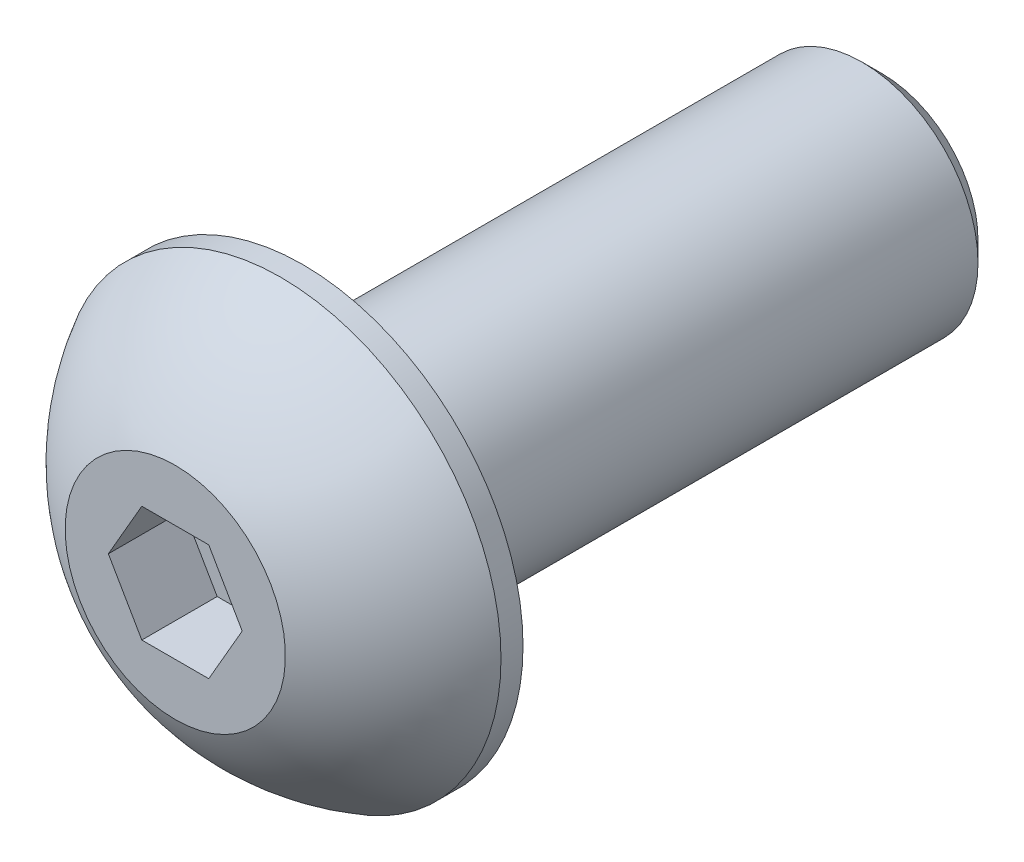
ISO-10303-21;
HEADER;
FILE_DESCRIPTION(('STEP AP214'),'2;1');
FILE_NAME('part.step','',(''),(''),'','','');
FILE_SCHEMA(('AUTOMOTIVE_DESIGN { 1 0 10303 214 1 1 1 1 }'));
ENDSEC;
DATA;
#1=APPLICATION_CONTEXT('core data for automotive mechanical design processes');
#2=APPLICATION_PROTOCOL_DEFINITION('international standard','automotive_design',2000,#1);
#3=PRODUCT_CONTEXT('',#1,'mechanical');
#4=PRODUCT('Part','Part','',(#3));
#5=PRODUCT_RELATED_PRODUCT_CATEGORY('part','',(#4));
#6=PRODUCT_DEFINITION_FORMATION('','',#4);
#7=PRODUCT_DEFINITION_CONTEXT('part definition',#1,'design');
#8=PRODUCT_DEFINITION('design','',#6,#7);
#9=PRODUCT_DEFINITION_SHAPE('','',#8);
#10=(LENGTH_UNIT() NAMED_UNIT(*) SI_UNIT(.MILLI.,.METRE.));
#11=(NAMED_UNIT(*) PLANE_ANGLE_UNIT() SI_UNIT($,.RADIAN.));
#12=(NAMED_UNIT(*) SI_UNIT($,.STERADIAN.) SOLID_ANGLE_UNIT());
#13=UNCERTAINTY_MEASURE_WITH_UNIT(LENGTH_MEASURE(1.E-05),#10,'distance_accuracy_value','');
#14=(GEOMETRIC_REPRESENTATION_CONTEXT(3) GLOBAL_UNCERTAINTY_ASSIGNED_CONTEXT((#13)) GLOBAL_UNIT_ASSIGNED_CONTEXT((#10,
#11,#12)) REPRESENTATION_CONTEXT('',''));
#15=CARTESIAN_POINT('',(0.,0.,0.));
#16=DIRECTION('',(0.,0.,1.));
#17=DIRECTION('',(1.,0.,0.));
#18=AXIS2_PLACEMENT_3D('',#15,#16,#17);
#19=CARTESIAN_POINT('',(0.,0.,-1.68527472527472));
#20=DIRECTION('',(0.,0.,-1.));
#21=DIRECTION('',(0.,-1.,0.));
#22=AXIS2_PLACEMENT_3D('',#19,#20,#21);
#23=SPHERICAL_SURFACE('',#22,4.3249693283142);
#24=CARTESIAN_POINT('',(0.,0.,2.2));
#25=DIRECTION('',(0.,0.,-1.));
#26=DIRECTION('',(0.,1.,0.));
#27=AXIS2_PLACEMENT_3D('',#24,#25,#26);
#28=CIRCLE('',#27,1.9);
#29=CARTESIAN_POINT('',(0.,-1.9,2.2));
#30=VERTEX_POINT('',#29);
#31=EDGE_CURVE('E184',#30,#30,#28,.T.);
#32=CARTESIAN_POINT('',(0.,0.,0.379999999999998));
#33=DIRECTION('',(0.,0.,-1.));
#34=DIRECTION('',(0.,1.,0.));
#35=AXIS2_PLACEMENT_3D('',#32,#33,#34);
#36=CIRCLE('',#35,3.8);
#37=CARTESIAN_POINT('',(0.,-3.8,0.379999999999998));
#38=VERTEX_POINT('',#37);
#39=EDGE_CURVE('E167',#38,#38,#36,.T.);
#40=CARTESIAN_POINT('',(0.,-1.9,2.2));
#41=CARTESIAN_POINT('',(0.,-1.9250168345864,2.18776615986538));
#42=CARTESIAN_POINT('',(0.,-1.94991547834234,2.1752906362405));
#43=CARTESIAN_POINT('',(0.,-1.99946716625955,2.14986101771974));
#44=CARTESIAN_POINT('',(0.,-2.02412021042083,2.13690692282386));
#45=CARTESIAN_POINT('',(0.,-2.07317148121498,2.11052495747061));
#46=CARTESIAN_POINT('',(0.,-2.09756970784785,2.09709708701323));
#47=CARTESIAN_POINT('',(0.,-2.14610224528364,2.06977259086845));
#48=CARTESIAN_POINT('',(0.,-2.17023655608655,2.05587596518104));
#49=CARTESIAN_POINT('',(0.,-2.21823225545407,2.02761914098968));
#50=CARTESIAN_POINT('',(0.,-2.24209364401868,2.01325894248572));
#51=CARTESIAN_POINT('',(0.,-2.28953459609717,1.98408033147872));
#52=CARTESIAN_POINT('',(0.,-2.31311415961106,1.96926191897566));
#53=CARTESIAN_POINT('',(0.,-2.35998266345818,1.93917240883671));
#54=CARTESIAN_POINT('',(0.,-2.38327160379141,1.92390131120081));
#55=CARTESIAN_POINT('',(0.,-2.42955017171145,1.89291212881537));
#56=CARTESIAN_POINT('',(0.,-2.45253979929826,1.87719404406583));
#57=CARTESIAN_POINT('',(0.,-2.49821116380567,1.84531675218651));
#58=CARTESIAN_POINT('',(0.,-2.52089290072626,1.82915754505673));
#59=CARTESIAN_POINT('',(0.,-2.56594002087097,1.79640403776007));
#60=CARTESIAN_POINT('',(0.,-2.58830540409509,1.77980973759318));
#61=CARTESIAN_POINT('',(0.,-2.63271147185239,1.74619223590302));
#62=CARTESIAN_POINT('',(0.,-2.65475215638556,1.72916903437974));
#63=CARTESIAN_POINT('',(0.,-2.69850060291903,1.69470008169092));
#64=CARTESIAN_POINT('',(0.,-2.72020836491933,1.67725433052536));
#65=CARTESIAN_POINT('',(0.,-2.76328286676534,1.64194678792786));
#66=CARTESIAN_POINT('',(0.,-2.78464960661105,1.62408499649592));
#67=CARTESIAN_POINT('',(0.,-2.82703409176873,1.587952037975));
#68=CARTESIAN_POINT('',(0.,-2.84805183708071,1.56968087088603));
#69=CARTESIAN_POINT('',(0.,-2.88973049100894,1.53273597840701));
#70=CARTESIAN_POINT('',(0.,-2.91039139962521,1.51406225301696));
#71=CARTESIAN_POINT('',(0.,-2.95134867114332,1.47631921149475));
#72=CARTESIAN_POINT('',(0.,-2.97164503404517,1.45724989536258));
#73=CARTESIAN_POINT('',(0.,-3.01186564113541,1.41872278751825));
#74=CARTESIAN_POINT('',(0.,-3.0317898853238,1.39926499580609));
#75=CARTESIAN_POINT('',(0.,-3.07125882083336,1.35996819691231));
#76=CARTESIAN_POINT('',(0.,-3.09080351215454,1.34012918973069));
#77=CARTESIAN_POINT('',(0.,-3.12950604939509,1.30007736224804));
#78=CARTESIAN_POINT('',(0.,-3.14866389531445,1.279864541947));
#79=CARTESIAN_POINT('',(0.,-3.18658559355691,1.23907263005305));
#80=CARTESIAN_POINT('',(0.,-3.20534944588,1.21849353846013));
#81=CARTESIAN_POINT('',(0.,-3.24247615574272,1.17697676247348));
#82=CARTESIAN_POINT('',(0.,-3.26083901328234,1.15603907807975));
#83=CARTESIAN_POINT('',(0.,-3.29715688201057,1.11381292878105));
#84=CARTESIAN_POINT('',(0.,-3.31511189319918,1.09252446387609));
#85=CARTESIAN_POINT('',(0.,-3.35060736983354,1.04960469672792));
#86=CARTESIAN_POINT('',(0.,-3.3681478352793,1.02797339448472));
#87=CARTESIAN_POINT('',(0.,-3.40280767571308,0.984376023753563));
#88=CARTESIAN_POINT('',(0.,-3.41992705070111,0.962409955265613));
#89=CARTESIAN_POINT('',(0.,-3.45373832261761,0.918151248044141));
#90=CARTESIAN_POINT('',(0.,-3.47043021954608,0.895858609310618));
#91=CARTESIAN_POINT('',(0.,-3.50338030725998,0.850955079457227));
#92=CARTESIAN_POINT('',(0.,-3.51963849804541,0.828344188337359));
#93=CARTESIAN_POINT('',(0.,-3.55171510715004,0.782812590280425));
#94=CARTESIAN_POINT('',(0.,-3.56753352546924,0.75989188334336));
#95=CARTESIAN_POINT('',(0.,-3.59872468764754,0.713749205957023));
#96=CARTESIAN_POINT('',(0.,-3.61409743150663,0.690527235507752));
#97=CARTESIAN_POINT('',(0.,-3.64439150816201,0.643790695298227));
#98=CARTESIAN_POINT('',(0.,-3.65931284095831,0.620276125537973));
#99=CARTESIAN_POINT('',(0.,-3.6886985306726,0.57296316199163));
#100=CARTESIAN_POINT('',(0.,-3.7031628875906,0.549164768205541));
#101=CARTESIAN_POINT('',(0.,-3.7316292187144,0.501293030668963));
#102=CARTESIAN_POINT('',(0.,-3.74563119292022,0.477219686918475));
#103=CARTESIAN_POINT('',(0.,-3.77316757105695,0.428807052692817));
#104=CARTESIAN_POINT('',(0.,-3.78670197498787,0.404467762217648));
#105=CARTESIAN_POINT('',(0.,-3.8,0.379999999999998));
#106=B_SPLINE_CURVE_WITH_KNOTS('',3,(#40,#41,#42,#43,#44,#45,#46,#47,#48,#49,#50,#51,#52,#53,
#54,#55,#56,#57,#58,#59,#60,#61,#62,#63,#64,#65,#66,#67,#68,#69,#70,#71,#72,#73,#74,#75,#76,#77,
#78,#79,#80,#81,#82,#83,#84,#85,#86,#87,#88,#89,#90,#91,#92,#93,#94,#95,#96,#97,#98,#99,#100,
#101,#102,#103,#104,#105),.UNSPECIFIED.,.F.,.F.,(4,2,2,2,2,2,2,2,2,2,2,2,2,2,2,2,2,2,2,2,2,2,2,
2,2,2,2,2,2,2,2,2,4),(0.,0.0835425780861791,0.167085156172359,0.250627734258538,
0.334170312344717,0.417712890430895,0.501255468517075,0.584798046603255,0.668340624689434,
0.751883202775613,0.835425780861792,0.918968358947972,1.00251093703415,1.08605351512033,
1.16959609320651,1.25313867129269,1.33668124937887,1.42022382746505,1.50376640555123,
1.5873089836374,1.67085156172358,1.75439413980976,1.83793671789594,1.92147929598212,
2.0050218740683,2.08856445215448,2.17210703024066,2.25564960832684,2.33919218641302,
2.4227347644992,2.50627734258538,2.58981992067156,2.67336249875773),.UNSPECIFIED.);
#107=EDGE_CURVE('BSEAM51',#30,#38,#106,.T.);
#108=ORIENTED_EDGE('',*,*,#31,.T.);
#109=ORIENTED_EDGE('',*,*,#39,.F.);
#110=ORIENTED_EDGE('',*,*,#107,.T.);
#111=ORIENTED_EDGE('',*,*,#107,.F.);
#112=EDGE_LOOP('',(#108,#110,#109,#111));
#113=FACE_BOUND('',#112,.T.);
#114=ADVANCED_FACE('F51',(#113),#23,.T.);
#115=CARTESIAN_POINT('',(0.,0.,2.2));
#116=DIRECTION('',(0.,0.,1.));
#117=DIRECTION('',(0.,-1.,0.));
#118=AXIS2_PLACEMENT_3D('',#115,#116,#117);
#119=PLANE('',#118);
#120=DIRECTION('',(0.5,0.866025403784439,0.));
#121=VECTOR('',#120,1.);
#122=CARTESIAN_POINT('',(0.577350269189627,-0.999999999999999,2.2));
#123=LINE('',#122,#121);
#124=CARTESIAN_POINT('',(0.577350269189627,-0.999999999999999,2.2));
#125=VERTEX_POINT('',#124);
#126=CARTESIAN_POINT('',(1.15470053837925,0.,2.2));
#127=VERTEX_POINT('',#126);
#128=EDGE_CURVE('E67',#125,#127,#123,.T.);
#129=ORIENTED_EDGE('',*,*,#128,.F.);
#130=DIRECTION('',(1.,0.,0.));
#131=VECTOR('',#130,1.);
#132=CARTESIAN_POINT('',(-0.577350269189627,-1.,2.2));
#133=LINE('',#132,#131);
#134=CARTESIAN_POINT('',(-0.577350269189627,-1.,2.2));
#135=VERTEX_POINT('',#134);
#136=EDGE_CURVE('E161',#135,#125,#133,.T.);
#137=ORIENTED_EDGE('',*,*,#136,.F.);
#138=DIRECTION('',(0.5,-0.866025403784438,0.));
#139=VECTOR('',#138,1.);
#140=CARTESIAN_POINT('',(-1.15470053837925,0.,2.2));
#141=LINE('',#140,#139);
#142=CARTESIAN_POINT('',(-1.15470053837925,0.,2.2));
#143=VERTEX_POINT('',#142);
#144=EDGE_CURVE('E158',#143,#135,#141,.T.);
#145=ORIENTED_EDGE('',*,*,#144,.F.);
#146=DIRECTION('',(-0.5,-0.866025403784439,0.));
#147=VECTOR('',#146,1.);
#148=CARTESIAN_POINT('',(-0.577350269189627,1.,2.2));
#149=LINE('',#148,#147);
#150=CARTESIAN_POINT('',(-0.577350269189627,1.,2.2));
#151=VERTEX_POINT('',#150);
#152=EDGE_CURVE('E115',#151,#143,#149,.T.);
#153=ORIENTED_EDGE('',*,*,#152,.F.);
#154=DIRECTION('',(-1.,0.,0.));
#155=VECTOR('',#154,1.);
#156=CARTESIAN_POINT('',(0.577350269189626,1.,2.2));
#157=LINE('',#156,#155);
#158=CARTESIAN_POINT('',(0.577350269189626,1.,2.2));
#159=VERTEX_POINT('',#158);
#160=EDGE_CURVE('E152',#159,#151,#157,.T.);
#161=ORIENTED_EDGE('',*,*,#160,.F.);
#162=DIRECTION('',(-0.5,0.866025403784438,0.));
#163=VECTOR('',#162,1.);
#164=CARTESIAN_POINT('',(1.15470053837925,0.,2.2));
#165=LINE('',#164,#163);
#166=EDGE_CURVE('E148',#127,#159,#165,.T.);
#167=ORIENTED_EDGE('',*,*,#166,.F.);
#168=EDGE_LOOP('',(#129,#137,#145,#153,#161,#167));
#169=FACE_BOUND('',#168,.T.);
#170=ORIENTED_EDGE('',*,*,#31,.F.);
#171=EDGE_LOOP('',(#170));
#172=FACE_BOUND('',#171,.T.);
#173=ADVANCED_FACE('F213',(#169,#172),#119,.T.);
#174=CARTESIAN_POINT('',(0.,-2.,-10.));
#175=DIRECTION('',(0.,0.,-1.));
#176=DIRECTION('',(0.,1.,0.));
#177=AXIS2_PLACEMENT_3D('',#174,#175,#176);
#178=PLANE('',#177);
#179=CARTESIAN_POINT('',(0.,0.,-10.));
#180=DIRECTION('',(0.,0.,-1.));
#181=DIRECTION('',(0.,1.,0.));
#182=AXIS2_PLACEMENT_3D('',#179,#180,#181);
#183=CIRCLE('',#182,1.64999999999999);
#184=CARTESIAN_POINT('',(0.,1.64999999999999,-10.));
#185=VERTEX_POINT('',#184);
#186=EDGE_CURVE('E188',#185,#185,#183,.T.);
#187=ORIENTED_EDGE('',*,*,#186,.T.);
#188=EDGE_LOOP('',(#187));
#189=FACE_BOUND('',#188,.T.);
#190=ADVANCED_FACE('F220',(#189),#178,.T.);
#191=CARTESIAN_POINT('',(0.,0.,-10.));
#192=DIRECTION('',(0.,0.,-1.));
#193=DIRECTION('',(0.,1.,0.));
#194=AXIS2_PLACEMENT_3D('',#191,#192,#193);
#195=CYLINDRICAL_SURFACE('',#194,1.99999999999999);
#196=CARTESIAN_POINT('',(0.,0.,-0.200000000000001));
#197=DIRECTION('',(0.,0.,-1.));
#198=DIRECTION('',(0.,1.,0.));
#199=AXIS2_PLACEMENT_3D('',#196,#197,#198);
#200=CIRCLE('',#199,1.99999999999999);
#201=CARTESIAN_POINT('',(0.,1.99999999999999,-0.2));
#202=VERTEX_POINT('',#201);
#203=EDGE_CURVE('E60',#202,#202,#200,.T.);
#204=ORIENTED_EDGE('',*,*,#203,.T.);
#205=EDGE_LOOP('',(#204));
#206=FACE_BOUND('',#205,.T.);
#207=CARTESIAN_POINT('',(0.,0.,-9.65));
#208=DIRECTION('',(0.,0.,-1.));
#209=DIRECTION('',(0.,1.,0.));
#210=AXIS2_PLACEMENT_3D('',#207,#208,#209);
#211=CIRCLE('',#210,1.99999999999999);
#212=CARTESIAN_POINT('',(0.,1.99999999999999,-9.65));
#213=VERTEX_POINT('',#212);
#214=EDGE_CURVE('E192',#213,#213,#211,.F.);
#215=ORIENTED_EDGE('',*,*,#214,.T.);
#216=EDGE_LOOP('',(#215));
#217=FACE_BOUND('',#216,.T.);
#218=ADVANCED_FACE('F200',(#206,#217),#195,.T.);
#219=CARTESIAN_POINT('',(0.,-3.8,0.));
#220=DIRECTION('',(0.,0.,-1.));
#221=DIRECTION('',(0.,1.,0.));
#222=AXIS2_PLACEMENT_3D('',#219,#220,#221);
#223=PLANE('',#222);
#224=CARTESIAN_POINT('',(0.,0.,0.));
#225=DIRECTION('',(0.,0.,-1.));
#226=DIRECTION('',(0.,1.,0.));
#227=AXIS2_PLACEMENT_3D('',#224,#225,#226);
#228=CIRCLE('',#227,2.19999999999999);
#229=CARTESIAN_POINT('',(0.,2.19999999999999,0.));
#230=VERTEX_POINT('',#229);
#231=EDGE_CURVE('E11',#230,#230,#228,.F.);
#232=ORIENTED_EDGE('',*,*,#231,.T.);
#233=EDGE_LOOP('',(#232));
#234=FACE_BOUND('',#233,.T.);
#235=CARTESIAN_POINT('',(0.,0.,0.));
#236=DIRECTION('',(0.,0.,-1.));
#237=DIRECTION('',(0.,1.,0.));
#238=AXIS2_PLACEMENT_3D('',#235,#236,#237);
#239=CIRCLE('',#238,3.8);
#240=CARTESIAN_POINT('',(0.,3.79999999999999,0.));
#241=VERTEX_POINT('',#240);
#242=EDGE_CURVE('E180',#241,#241,#239,.T.);
#243=ORIENTED_EDGE('',*,*,#242,.T.);
#244=EDGE_LOOP('',(#243));
#245=FACE_BOUND('',#244,.T.);
#246=ADVANCED_FACE('F230',(#234,#245),#223,.T.);
#247=CARTESIAN_POINT('',(0.,0.,-10.));
#248=DIRECTION('',(0.,0.,-1.));
#249=DIRECTION('',(0.,1.,0.));
#250=AXIS2_PLACEMENT_3D('',#247,#248,#249);
#251=CYLINDRICAL_SURFACE('',#250,3.8);
#252=ORIENTED_EDGE('',*,*,#39,.T.);
#253=EDGE_LOOP('',(#252));
#254=FACE_BOUND('',#253,.T.);
#255=ORIENTED_EDGE('',*,*,#242,.F.);
#256=EDGE_LOOP('',(#255));
#257=FACE_BOUND('',#256,.T.);
#258=ADVANCED_FACE('F232',(#254,#257),#251,.T.);
#259=CARTESIAN_POINT('',(0.577350269189627,-0.999999999999999,0.900000000000001));
#260=DIRECTION('',(0.866025403784439,-0.5,0.));
#261=DIRECTION('',(0.5,0.866025403784439,0.));
#262=AXIS2_PLACEMENT_3D('',#259,#260,#261);
#263=PLANE('',#262);
#264=ORIENTED_EDGE('',*,*,#128,.T.);
#265=DIRECTION('',(0.,0.,1.));
#266=VECTOR('',#265,1.);
#267=CARTESIAN_POINT('',(1.15470053837925,0.,0.900000000000001));
#268=LINE('',#267,#266);
#269=CARTESIAN_POINT('',(1.15470053837925,0.,0.900000000000001));
#270=VERTEX_POINT('',#269);
#271=EDGE_CURVE('E97',#270,#127,#268,.T.);
#272=ORIENTED_EDGE('',*,*,#271,.F.);
#273=DIRECTION('',(0.5,0.866025403784439,0.));
#274=VECTOR('',#273,1.);
#275=CARTESIAN_POINT('',(0.577350269189627,-0.999999999999999,0.900000000000001));
#276=LINE('',#275,#274);
#277=CARTESIAN_POINT('',(0.577350269189627,-0.999999999999999,0.900000000000001));
#278=VERTEX_POINT('',#277);
#279=EDGE_CURVE('E164',#278,#270,#276,.T.);
#280=ORIENTED_EDGE('',*,*,#279,.F.);
#281=DIRECTION('',(0.,0.,1.));
#282=VECTOR('',#281,1.);
#283=CARTESIAN_POINT('',(0.577350269189627,-0.999999999999999,0.900000000000001));
#284=LINE('',#283,#282);
#285=EDGE_CURVE('E75',#278,#125,#284,.T.);
#286=ORIENTED_EDGE('',*,*,#285,.T.);
#287=EDGE_LOOP('',(#264,#272,#280,#286));
#288=FACE_BOUND('',#287,.T.);
#289=ADVANCED_FACE('F235',(#288),#263,.F.);
#290=CARTESIAN_POINT('',(-0.577350269189627,-1.,0.900000000000001));
#291=DIRECTION('',(0.,-1.,0.));
#292=DIRECTION('',(1.,0.,0.));
#293=AXIS2_PLACEMENT_3D('',#290,#291,#292);
#294=PLANE('',#293);
#295=ORIENTED_EDGE('',*,*,#136,.T.);
#296=ORIENTED_EDGE('',*,*,#285,.F.);
#297=DIRECTION('',(1.,0.,0.));
#298=VECTOR('',#297,1.);
#299=CARTESIAN_POINT('',(-0.577350269189627,-1.,0.900000000000001));
#300=LINE('',#299,#298);
#301=CARTESIAN_POINT('',(-0.577350269189627,-1.,0.900000000000001));
#302=VERTEX_POINT('',#301);
#303=EDGE_CURVE('E129',#302,#278,#300,.T.);
#304=ORIENTED_EDGE('',*,*,#303,.F.);
#305=DIRECTION('',(0.,0.,1.));
#306=VECTOR('',#305,1.);
#307=CARTESIAN_POINT('',(-0.577350269189627,-1.,0.900000000000001));
#308=LINE('',#307,#306);
#309=EDGE_CURVE('E120',#302,#135,#308,.T.);
#310=ORIENTED_EDGE('',*,*,#309,.T.);
#311=EDGE_LOOP('',(#295,#296,#304,#310));
#312=FACE_BOUND('',#311,.T.);
#313=ADVANCED_FACE('F239',(#312),#294,.F.);
#314=CARTESIAN_POINT('',(-1.15470053837925,0.,0.900000000000001));
#315=DIRECTION('',(-0.866025403784438,-0.5,0.));
#316=DIRECTION('',(0.5,-0.866025403784438,0.));
#317=AXIS2_PLACEMENT_3D('',#314,#315,#316);
#318=PLANE('',#317);
#319=ORIENTED_EDGE('',*,*,#144,.T.);
#320=ORIENTED_EDGE('',*,*,#309,.F.);
#321=DIRECTION('',(0.5,-0.866025403784438,0.));
#322=VECTOR('',#321,1.);
#323=CARTESIAN_POINT('',(-1.15470053837925,0.,0.900000000000001));
#324=LINE('',#323,#322);
#325=CARTESIAN_POINT('',(-1.15470053837925,0.,0.900000000000001));
#326=VERTEX_POINT('',#325);
#327=EDGE_CURVE('E124',#326,#302,#324,.T.);
#328=ORIENTED_EDGE('',*,*,#327,.F.);
#329=DIRECTION('',(0.,0.,1.));
#330=VECTOR('',#329,1.);
#331=CARTESIAN_POINT('',(-1.15470053837925,0.,0.900000000000001));
#332=LINE('',#331,#330);
#333=EDGE_CURVE('E108',#326,#143,#332,.T.);
#334=ORIENTED_EDGE('',*,*,#333,.T.);
#335=EDGE_LOOP('',(#319,#320,#328,#334));
#336=FACE_BOUND('',#335,.T.);
#337=ADVANCED_FACE('F125',(#336),#318,.F.);
#338=CARTESIAN_POINT('',(-0.577350269189627,1.,0.900000000000001));
#339=DIRECTION('',(-0.866025403784439,0.5,0.));
#340=DIRECTION('',(-0.5,-0.866025403784439,0.));
#341=AXIS2_PLACEMENT_3D('',#338,#339,#340);
#342=PLANE('',#341);
#343=ORIENTED_EDGE('',*,*,#152,.T.);
#344=ORIENTED_EDGE('',*,*,#333,.F.);
#345=DIRECTION('',(-0.5,-0.866025403784439,0.));
#346=VECTOR('',#345,1.);
#347=CARTESIAN_POINT('',(-0.577350269189627,1.,0.900000000000001));
#348=LINE('',#347,#346);
#349=CARTESIAN_POINT('',(-0.577350269189627,1.,0.900000000000001));
#350=VERTEX_POINT('',#349);
#351=EDGE_CURVE('E112',#350,#326,#348,.T.);
#352=ORIENTED_EDGE('',*,*,#351,.F.);
#353=DIRECTION('',(0.,0.,1.));
#354=VECTOR('',#353,1.);
#355=CARTESIAN_POINT('',(-0.577350269189627,1.,0.900000000000001));
#356=LINE('',#355,#354);
#357=EDGE_CURVE('E121',#350,#151,#356,.T.);
#358=ORIENTED_EDGE('',*,*,#357,.T.);
#359=EDGE_LOOP('',(#343,#344,#352,#358));
#360=FACE_BOUND('',#359,.T.);
#361=ADVANCED_FACE('F110',(#360),#342,.F.);
#362=CARTESIAN_POINT('',(0.577350269189626,1.,0.900000000000001));
#363=DIRECTION('',(0.,1.,0.));
#364=DIRECTION('',(-1.,0.,0.));
#365=AXIS2_PLACEMENT_3D('',#362,#363,#364);
#366=PLANE('',#365);
#367=ORIENTED_EDGE('',*,*,#160,.T.);
#368=ORIENTED_EDGE('',*,*,#357,.F.);
#369=DIRECTION('',(-1.,0.,0.));
#370=VECTOR('',#369,1.);
#371=CARTESIAN_POINT('',(0.577350269189626,1.,0.900000000000001));
#372=LINE('',#371,#370);
#373=CARTESIAN_POINT('',(0.577350269189626,1.,0.900000000000001));
#374=VERTEX_POINT('',#373);
#375=EDGE_CURVE('E135',#374,#350,#372,.T.);
#376=ORIENTED_EDGE('',*,*,#375,.F.);
#377=DIRECTION('',(0.,0.,1.));
#378=VECTOR('',#377,1.);
#379=CARTESIAN_POINT('',(0.577350269189626,1.,0.900000000000001));
#380=LINE('',#379,#378);
#381=EDGE_CURVE('E172',#374,#159,#380,.T.);
#382=ORIENTED_EDGE('',*,*,#381,.T.);
#383=EDGE_LOOP('',(#367,#368,#376,#382));
#384=FACE_BOUND('',#383,.T.);
#385=ADVANCED_FACE('F243',(#384),#366,.F.);
#386=CARTESIAN_POINT('',(1.15470053837925,0.,0.900000000000001));
#387=DIRECTION('',(0.866025403784438,0.5,0.));
#388=DIRECTION('',(-0.5,0.866025403784438,0.));
#389=AXIS2_PLACEMENT_3D('',#386,#387,#388);
#390=PLANE('',#389);
#391=ORIENTED_EDGE('',*,*,#166,.T.);
#392=ORIENTED_EDGE('',*,*,#381,.F.);
#393=DIRECTION('',(-0.5,0.866025403784438,0.));
#394=VECTOR('',#393,1.);
#395=CARTESIAN_POINT('',(1.15470053837925,0.,0.900000000000001));
#396=LINE('',#395,#394);
#397=EDGE_CURVE('E140',#270,#374,#396,.T.);
#398=ORIENTED_EDGE('',*,*,#397,.F.);
#399=ORIENTED_EDGE('',*,*,#271,.T.);
#400=EDGE_LOOP('',(#391,#392,#398,#399));
#401=FACE_BOUND('',#400,.T.);
#402=ADVANCED_FACE('F240',(#401),#390,.F.);
#403=CARTESIAN_POINT('',(1.15470053837925,0.,0.900000000000001));
#404=DIRECTION('',(0.,0.,1.));
#405=DIRECTION('',(1.,0.,0.));
#406=AXIS2_PLACEMENT_3D('',#403,#404,#405);
#407=PLANE('',#406);
#408=ORIENTED_EDGE('',*,*,#279,.T.);
#409=ORIENTED_EDGE('',*,*,#397,.T.);
#410=ORIENTED_EDGE('',*,*,#375,.T.);
#411=ORIENTED_EDGE('',*,*,#351,.T.);
#412=ORIENTED_EDGE('',*,*,#327,.T.);
#413=ORIENTED_EDGE('',*,*,#303,.T.);
#414=EDGE_LOOP('',(#408,#409,#410,#411,#412,#413));
#415=FACE_BOUND('',#414,.T.);
#416=ADVANCED_FACE('F132',(#415),#407,.T.);
#417=CARTESIAN_POINT('',(0.,0.,-10.));
#418=DIRECTION('',(0.,0.,1.));
#419=DIRECTION('',(0.,-1.,0.));
#420=AXIS2_PLACEMENT_3D('',#417,#418,#419);
#421=CONICAL_SURFACE('',#420,1.64999999999999,0.785398163397446);
#422=ORIENTED_EDGE('',*,*,#214,.F.);
#423=EDGE_LOOP('',(#422));
#424=FACE_BOUND('',#423,.T.);
#425=ORIENTED_EDGE('',*,*,#186,.F.);
#426=EDGE_LOOP('',(#425));
#427=FACE_BOUND('',#426,.T.);
#428=ADVANCED_FACE('F204',(#424,#427),#421,.T.);
#429=CARTESIAN_POINT('',(0.,0.,-0.200000000000001));
#430=DIRECTION('',(0.,0.,-1.));
#431=DIRECTION('',(0.,1.,0.));
#432=AXIS2_PLACEMENT_3D('',#429,#430,#431);
#433=TOROIDAL_SURFACE('',#432,2.19999999999999,0.2);
#434=ORIENTED_EDGE('',*,*,#231,.F.);
#435=EDGE_LOOP('',(#434));
#436=FACE_BOUND('',#435,.T.);
#437=ORIENTED_EDGE('',*,*,#203,.F.);
#438=EDGE_LOOP('',(#437));
#439=FACE_BOUND('',#438,.T.);
#440=ADVANCED_FACE('F53',(#436,#439),#433,.F.);
#441=CLOSED_SHELL('',(#114,#173,#190,#218,#246,#258,#289,#313,#337,#361,#385,#402,#416,#428,#440));
#442=MANIFOLD_SOLID_BREP('B2',#441);
#443=ADVANCED_BREP_SHAPE_REPRESENTATION('',(#18,#442),#14);
#444=SHAPE_DEFINITION_REPRESENTATION(#9,#443);
ENDSEC;
END-ISO-10303-21;
